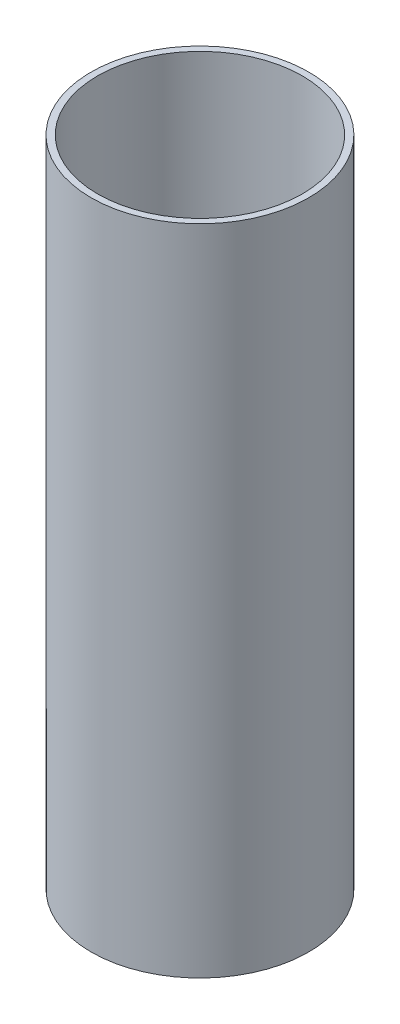
ISO-10303-21;
HEADER;
FILE_DESCRIPTION(('STEP AP214'),'2;1');
FILE_NAME('part.step','',(''),(''),'','','');
FILE_SCHEMA(('AUTOMOTIVE_DESIGN { 1 0 10303 214 1 1 1 1 }'));
ENDSEC;
DATA;
#1=APPLICATION_CONTEXT('core data for automotive mechanical design processes');
#2=APPLICATION_PROTOCOL_DEFINITION('international standard','automotive_design',2000,#1);
#3=PRODUCT_CONTEXT('',#1,'mechanical');
#4=PRODUCT('Part','Part','',(#3));
#5=PRODUCT_RELATED_PRODUCT_CATEGORY('part','',(#4));
#6=PRODUCT_DEFINITION_FORMATION('','',#4);
#7=PRODUCT_DEFINITION_CONTEXT('part definition',#1,'design');
#8=PRODUCT_DEFINITION('design','',#6,#7);
#9=PRODUCT_DEFINITION_SHAPE('','',#8);
#10=(LENGTH_UNIT() NAMED_UNIT(*) SI_UNIT(.MILLI.,.METRE.));
#11=(NAMED_UNIT(*) PLANE_ANGLE_UNIT() SI_UNIT($,.RADIAN.));
#12=(NAMED_UNIT(*) SI_UNIT($,.STERADIAN.) SOLID_ANGLE_UNIT());
#13=UNCERTAINTY_MEASURE_WITH_UNIT(LENGTH_MEASURE(1.E-05),#10,'distance_accuracy_value','');
#14=(GEOMETRIC_REPRESENTATION_CONTEXT(3) GLOBAL_UNCERTAINTY_ASSIGNED_CONTEXT((#13)) GLOBAL_UNIT_ASSIGNED_CONTEXT((#10,
#11,#12)) REPRESENTATION_CONTEXT('',''));
#15=CARTESIAN_POINT('',(0.,0.,0.));
#16=DIRECTION('',(0.,0.,1.));
#17=DIRECTION('',(1.,0.,0.));
#18=AXIS2_PLACEMENT_3D('',#15,#16,#17);
#19=CARTESIAN_POINT('',(0.,150.,0.));
#20=DIRECTION('',(0.,1.,0.));
#21=DIRECTION('',(0.,0.,1.));
#22=AXIS2_PLACEMENT_3D('',#19,#20,#21);
#23=PLANE('',#22);
#24=CARTESIAN_POINT('',(0.,150.,0.));
#25=DIRECTION('',(0.,1.,0.));
#26=DIRECTION('',(0.,0.,1.));
#27=AXIS2_PLACEMENT_3D('',#24,#25,#26);
#28=CIRCLE('',#27,25.);
#29=CARTESIAN_POINT('',(0.,150.,25.));
#30=VERTEX_POINT('',#29);
#31=EDGE_CURVE('E10',#30,#30,#28,.T.);
#32=ORIENTED_EDGE('',*,*,#31,.T.);
#33=EDGE_LOOP('',(#32));
#34=FACE_BOUND('',#33,.T.);
#35=CARTESIAN_POINT('',(0.,150.,0.));
#36=DIRECTION('',(0.,1.,0.));
#37=DIRECTION('',(0.,0.,1.));
#38=AXIS2_PLACEMENT_3D('',#35,#36,#37);
#39=CIRCLE('',#38,23.5);
#40=CARTESIAN_POINT('',(0.,150.,23.5));
#41=VERTEX_POINT('',#40);
#42=EDGE_CURVE('E44',#41,#41,#39,.T.);
#43=ORIENTED_EDGE('',*,*,#42,.F.);
#44=EDGE_LOOP('',(#43));
#45=FACE_BOUND('',#44,.T.);
#46=ADVANCED_FACE('F33',(#34,#45),#23,.T.);
#47=CARTESIAN_POINT('',(0.,0.,0.));
#48=DIRECTION('',(0.,1.,0.));
#49=DIRECTION('',(0.,0.,1.));
#50=AXIS2_PLACEMENT_3D('',#47,#48,#49);
#51=PLANE('',#50);
#52=CARTESIAN_POINT('',(0.,0.,0.));
#53=DIRECTION('',(0.,1.,0.));
#54=DIRECTION('',(0.,0.,1.));
#55=AXIS2_PLACEMENT_3D('',#52,#53,#54);
#56=CIRCLE('',#55,25.);
#57=CARTESIAN_POINT('',(0.,0.,25.));
#58=VERTEX_POINT('',#57);
#59=EDGE_CURVE('E37',#58,#58,#56,.T.);
#60=ORIENTED_EDGE('',*,*,#59,.F.);
#61=EDGE_LOOP('',(#60));
#62=FACE_BOUND('',#61,.T.);
#63=CARTESIAN_POINT('',(0.,0.,0.));
#64=DIRECTION('',(0.,1.,0.));
#65=DIRECTION('',(0.,0.,1.));
#66=AXIS2_PLACEMENT_3D('',#63,#64,#65);
#67=CIRCLE('',#66,23.5);
#68=CARTESIAN_POINT('',(0.,0.,23.5));
#69=VERTEX_POINT('',#68);
#70=EDGE_CURVE('E46',#69,#69,#67,.T.);
#71=ORIENTED_EDGE('',*,*,#70,.T.);
#72=EDGE_LOOP('',(#71));
#73=FACE_BOUND('',#72,.T.);
#74=ADVANCED_FACE('F56',(#62,#73),#51,.F.);
#75=CARTESIAN_POINT('',(0.,150.,0.));
#76=DIRECTION('',(0.,-1.,0.));
#77=DIRECTION('',(0.,0.,-1.));
#78=AXIS2_PLACEMENT_3D('',#75,#76,#77);
#79=CYLINDRICAL_SURFACE('',#78,25.);
#80=ORIENTED_EDGE('',*,*,#31,.F.);
#81=EDGE_LOOP('',(#80));
#82=FACE_BOUND('',#81,.T.);
#83=ORIENTED_EDGE('',*,*,#59,.T.);
#84=EDGE_LOOP('',(#83));
#85=FACE_BOUND('',#84,.T.);
#86=ADVANCED_FACE('F35',(#82,#85),#79,.T.);
#87=CARTESIAN_POINT('',(0.,150.,0.));
#88=DIRECTION('',(0.,-1.,0.));
#89=DIRECTION('',(0.,0.,-1.));
#90=AXIS2_PLACEMENT_3D('',#87,#88,#89);
#91=CYLINDRICAL_SURFACE('',#90,23.5);
#92=ORIENTED_EDGE('',*,*,#42,.T.);
#93=EDGE_LOOP('',(#92));
#94=FACE_BOUND('',#93,.T.);
#95=ORIENTED_EDGE('',*,*,#70,.F.);
#96=EDGE_LOOP('',(#95));
#97=FACE_BOUND('',#96,.T.);
#98=ADVANCED_FACE('F52',(#94,#97),#91,.F.);
#99=CLOSED_SHELL('',(#46,#74,#86,#98));
#100=MANIFOLD_SOLID_BREP('B2',#99);
#101=ADVANCED_BREP_SHAPE_REPRESENTATION('',(#18,#100),#14);
#102=SHAPE_DEFINITION_REPRESENTATION(#9,#101);
ENDSEC;
END-ISO-10303-21;
